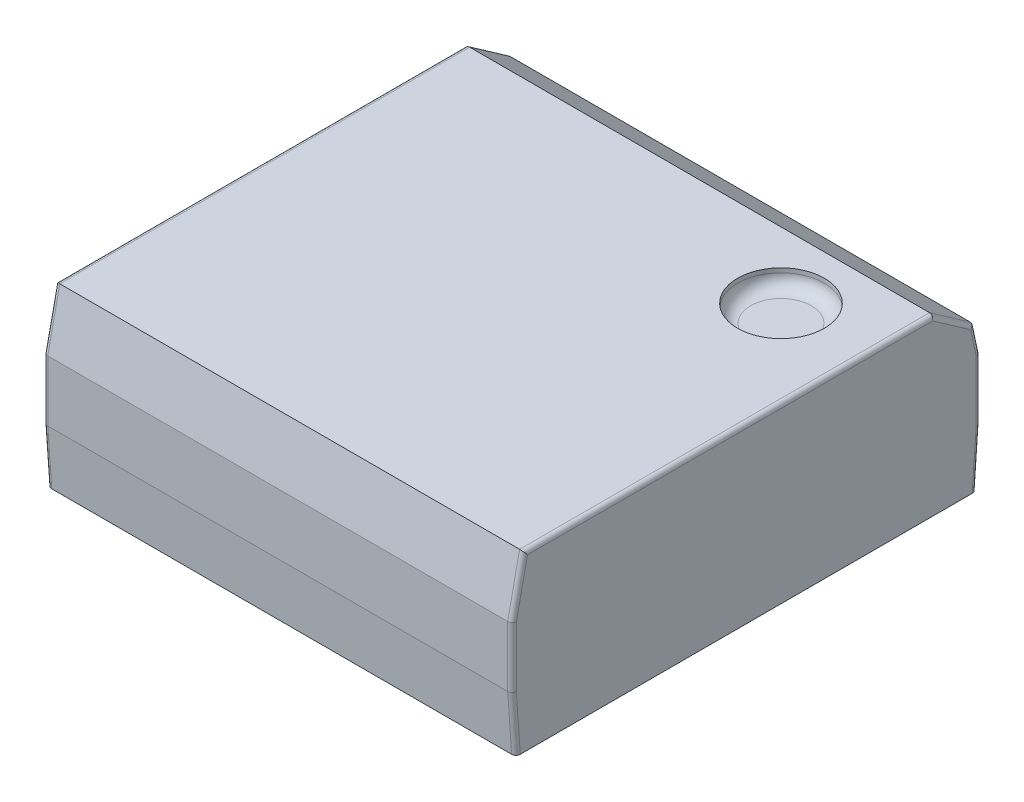
ISO-10303-21;
HEADER;
FILE_DESCRIPTION(('STEP AP214'),'2;1');
FILE_NAME('part.step','',(''),(''),'','','');
FILE_SCHEMA(('AUTOMOTIVE_DESIGN { 1 0 10303 214 1 1 1 1 }'));
ENDSEC;
DATA;
#1=APPLICATION_CONTEXT('core data for automotive mechanical design processes');
#2=APPLICATION_PROTOCOL_DEFINITION('international standard','automotive_design',2000,#1);
#3=PRODUCT_CONTEXT('',#1,'mechanical');
#4=PRODUCT('Part','Part','',(#3));
#5=PRODUCT_RELATED_PRODUCT_CATEGORY('part','',(#4));
#6=PRODUCT_DEFINITION_FORMATION('','',#4);
#7=PRODUCT_DEFINITION_CONTEXT('part definition',#1,'design');
#8=PRODUCT_DEFINITION('design','',#6,#7);
#9=PRODUCT_DEFINITION_SHAPE('','',#8);
#10=(LENGTH_UNIT() NAMED_UNIT(*) SI_UNIT(.MILLI.,.METRE.));
#11=(NAMED_UNIT(*) PLANE_ANGLE_UNIT() SI_UNIT($,.RADIAN.));
#12=(NAMED_UNIT(*) SI_UNIT($,.STERADIAN.) SOLID_ANGLE_UNIT());
#13=UNCERTAINTY_MEASURE_WITH_UNIT(LENGTH_MEASURE(1.E-05),#10,'distance_accuracy_value','');
#14=(GEOMETRIC_REPRESENTATION_CONTEXT(3) GLOBAL_UNCERTAINTY_ASSIGNED_CONTEXT((#13)) GLOBAL_UNIT_ASSIGNED_CONTEXT((#10,
#11,#12)) REPRESENTATION_CONTEXT('',''));
#15=CARTESIAN_POINT('',(0.,0.,0.));
#16=DIRECTION('',(0.,0.,1.));
#17=DIRECTION('',(1.,0.,0.));
#18=AXIS2_PLACEMENT_3D('',#15,#16,#17);
#19=CARTESIAN_POINT('',(1.7,0.8,-1.4));
#20=DIRECTION('',(0.,1.,0.));
#21=DIRECTION('',(0.,0.,1.));
#22=AXIS2_PLACEMENT_3D('',#19,#20,#21);
#23=PLANE('',#22);
#24=CARTESIAN_POINT('',(1.7,0.8,-1.4));
#25=DIRECTION('',(0.,-1.,0.));
#26=DIRECTION('',(0.,0.,-1.));
#27=AXIS2_PLACEMENT_3D('',#24,#25,#26);
#28=CIRCLE('',#27,0.350000000000002);
#29=CARTESIAN_POINT('',(1.7,0.8,-1.05));
#30=VERTEX_POINT('',#29);
#31=CARTESIAN_POINT('',(1.7,0.8,-1.75));
#32=VERTEX_POINT('',#31);
#33=EDGE_CURVE('E283',#30,#32,#28,.F.);
#34=ORIENTED_EDGE('',*,*,#33,.T.);
#35=CARTESIAN_POINT('',(1.7,0.8,-1.4));
#36=DIRECTION('',(0.,-1.,0.));
#37=DIRECTION('',(0.,0.,1.));
#38=AXIS2_PLACEMENT_3D('',#35,#36,#37);
#39=CIRCLE('',#38,0.350000000000002);
#40=EDGE_CURVE('E285',#32,#30,#39,.F.);
#41=ORIENTED_EDGE('',*,*,#40,.T.);
#42=EDGE_LOOP('',(#34,#41));
#43=FACE_BOUND('',#42,.T.);
#44=ADVANCED_FACE('F17',(#43),#23,.T.);
#45=CARTESIAN_POINT('',(1.7,0.95,-1.4));
#46=DIRECTION('',(0.,1.,0.));
#47=DIRECTION('',(0.,0.,1.));
#48=AXIS2_PLACEMENT_3D('',#45,#46,#47);
#49=TOROIDAL_SURFACE('',#48,0.350000000000002,0.15);
#50=CARTESIAN_POINT('',(1.7,0.95,-1.4));
#51=DIRECTION('',(0.,1.,0.));
#52=DIRECTION('',(0.,0.,1.));
#53=AXIS2_PLACEMENT_3D('',#50,#51,#52);
#54=CIRCLE('',#53,0.500000000000002);
#55=CARTESIAN_POINT('',(1.7,0.95,-0.899999999999999));
#56=VERTEX_POINT('',#55);
#57=EDGE_CURVE('E192',#56,#56,#54,.T.);
#58=ORIENTED_EDGE('',*,*,#57,.T.);
#59=EDGE_LOOP('',(#58));
#60=FACE_BOUND('',#59,.T.);
#61=ORIENTED_EDGE('',*,*,#40,.F.);
#62=ORIENTED_EDGE('',*,*,#33,.F.);
#63=EDGE_LOOP('',(#61,#62));
#64=FACE_BOUND('',#63,.T.);
#65=ADVANCED_FACE('F196',(#60,#64),#49,.F.);
#66=CARTESIAN_POINT('',(1.7,0.8,-1.4));
#67=DIRECTION('',(0.,1.,0.));
#68=DIRECTION('',(0.,0.,1.));
#69=AXIS2_PLACEMENT_3D('',#66,#67,#68);
#70=CYLINDRICAL_SURFACE('',#69,0.500000000000002);
#71=CARTESIAN_POINT('',(1.7,1.,-1.4));
#72=DIRECTION('',(0.,1.,0.));
#73=DIRECTION('',(0.,0.,1.));
#74=AXIS2_PLACEMENT_3D('',#71,#72,#73);
#75=CIRCLE('',#74,0.500000000000002);
#76=CARTESIAN_POINT('',(1.7,1.,-0.899999999999999));
#77=VERTEX_POINT('',#76);
#78=EDGE_CURVE('E179',#77,#77,#75,.F.);
#79=ORIENTED_EDGE('',*,*,#78,.F.);
#80=EDGE_LOOP('',(#79));
#81=FACE_BOUND('',#80,.T.);
#82=ORIENTED_EDGE('',*,*,#57,.F.);
#83=EDGE_LOOP('',(#82));
#84=FACE_BOUND('',#83,.T.);
#85=ADVANCED_FACE('F200',(#81,#84),#70,.F.);
#86=CARTESIAN_POINT('',(-2.7,1.,-2.16183823491448));
#87=DIRECTION('',(0.,0.819152044288992,-0.573576436351046));
#88=DIRECTION('',(0.,0.573576436351046,0.819152044288992));
#89=AXIS2_PLACEMENT_3D('',#86,#87,#88);
#90=PLANE('',#89);
#91=DIRECTION('',(1.,0.,0.));
#92=VECTOR('',#91,1.);
#93=CARTESIAN_POINT('',(-2.7,1.,-2.16183823491448));
#94=LINE('',#93,#92);
#95=CARTESIAN_POINT('',(2.65,1.,-2.16183823491449));
#96=VERTEX_POINT('',#95);
#97=CARTESIAN_POINT('',(-2.65,1.,-2.16183823491449));
#98=VERTEX_POINT('',#97);
#99=EDGE_CURVE('E176',#96,#98,#94,.F.);
#100=ORIENTED_EDGE('',*,*,#99,.F.);
#101=DIRECTION('',(0.,0.573576436351046,0.819152044288992));
#102=VECTOR('',#101,1.);
#103=CARTESIAN_POINT('',(2.65,1.,-2.16183823491448));
#104=LINE('',#103,#102);
#105=CARTESIAN_POINT('',(2.65,0.670942073818004,-2.631781656294));
#106=VERTEX_POINT('',#105);
#107=EDGE_CURVE('E187',#96,#106,#104,.F.);
#108=ORIENTED_EDGE('',*,*,#107,.T.);
#109=DIRECTION('',(1.,0.,0.));
#110=VECTOR('',#109,1.);
#111=CARTESIAN_POINT('',(-2.7,0.670942073818004,-2.631781656294));
#112=LINE('',#111,#110);
#113=CARTESIAN_POINT('',(-2.65,0.670942073818004,-2.631781656294));
#114=VERTEX_POINT('',#113);
#115=EDGE_CURVE('E184',#106,#114,#112,.F.);
#116=ORIENTED_EDGE('',*,*,#115,.T.);
#117=DIRECTION('',(0.,0.573576436351046,0.819152044288992));
#118=VECTOR('',#117,1.);
#119=CARTESIAN_POINT('',(-2.65,1.,-2.16183823491448));
#120=LINE('',#119,#118);
#121=EDGE_CURVE('E190',#114,#98,#120,.T.);
#122=ORIENTED_EDGE('',*,*,#121,.T.);
#123=EDGE_LOOP('',(#100,#108,#116,#122));
#124=FACE_BOUND('',#123,.T.);
#125=ADVANCED_FACE('F308',(#124),#90,.T.);
#126=CARTESIAN_POINT('',(-2.7,1.,-2.56183823491449));
#127=DIRECTION('',(0.,-0.207911690817757,0.978147600733806));
#128=DIRECTION('',(0.,-0.978147600733806,-0.207911690817757));
#129=AXIS2_PLACEMENT_3D('',#126,#127,#128);
#130=PLANE('',#129);
#131=DIRECTION('',(0.,-0.978147600733806,-0.207911690817757));
#132=VECTOR('',#131,1.);
#133=CARTESIAN_POINT('',(-2.65,1.,-2.56183823491449));
#134=LINE('',#133,#132);
#135=CARTESIAN_POINT('',(-2.65,0.34999999999999,-2.7));
#136=VERTEX_POINT('',#135);
#137=EDGE_CURVE('E182',#114,#136,#134,.T.);
#138=ORIENTED_EDGE('',*,*,#137,.F.);
#139=ORIENTED_EDGE('',*,*,#115,.F.);
#140=DIRECTION('',(0.,-0.978147600733806,-0.207911690817757));
#141=VECTOR('',#140,1.);
#142=CARTESIAN_POINT('',(2.65,-0.941643183908757,-2.97454723407616));
#143=LINE('',#142,#141);
#144=CARTESIAN_POINT('',(2.65,0.349999999999989,-2.7));
#145=VERTEX_POINT('',#144);
#146=EDGE_CURVE('E149',#145,#106,#143,.F.);
#147=ORIENTED_EDGE('',*,*,#146,.F.);
#148=DIRECTION('',(-1.,0.,0.));
#149=VECTOR('',#148,1.);
#150=CARTESIAN_POINT('',(-2.7,0.349999999999989,-2.7));
#151=LINE('',#150,#149);
#152=EDGE_CURVE('E171',#136,#145,#151,.F.);
#153=ORIENTED_EDGE('',*,*,#152,.F.);
#154=EDGE_LOOP('',(#138,#139,#147,#153));
#155=FACE_BOUND('',#154,.T.);
#156=ADVANCED_FACE('F314',(#155),#130,.F.);
#157=CARTESIAN_POINT('',(-2.7,1.,2.7));
#158=DIRECTION('',(0.,1.,0.));
#159=DIRECTION('',(0.,0.,1.));
#160=AXIS2_PLACEMENT_3D('',#157,#158,#159);
#161=PLANE('',#160);
#162=DIRECTION('',(1.,0.,0.));
#163=VECTOR('',#162,1.);
#164=CARTESIAN_POINT('',(-2.7,1.,2.56183823491449));
#165=LINE('',#164,#163);
#166=CARTESIAN_POINT('',(-2.65,1.,2.56183823491449));
#167=VERTEX_POINT('',#166);
#168=CARTESIAN_POINT('',(2.65,1.,2.56183823491449));
#169=VERTEX_POINT('',#168);
#170=EDGE_CURVE('E165',#167,#169,#165,.T.);
#171=ORIENTED_EDGE('',*,*,#170,.T.);
#172=DIRECTION('',(0.,0.,-1.));
#173=VECTOR('',#172,1.);
#174=CARTESIAN_POINT('',(2.65,1.,2.7));
#175=LINE('',#174,#173);
#176=EDGE_CURVE('E161',#96,#169,#175,.F.);
#177=ORIENTED_EDGE('',*,*,#176,.F.);
#178=ORIENTED_EDGE('',*,*,#99,.T.);
#179=DIRECTION('',(0.,0.,1.));
#180=VECTOR('',#179,1.);
#181=CARTESIAN_POINT('',(-2.65,1.,2.7));
#182=LINE('',#181,#180);
#183=EDGE_CURVE('E265',#167,#98,#182,.F.);
#184=ORIENTED_EDGE('',*,*,#183,.F.);
#185=EDGE_LOOP('',(#171,#177,#178,#184));
#186=FACE_BOUND('',#185,.T.);
#187=ORIENTED_EDGE('',*,*,#78,.T.);
#188=EDGE_LOOP('',(#187));
#189=FACE_BOUND('',#188,.T.);
#190=ADVANCED_FACE('F409',(#186,#189),#161,.T.);
#191=CARTESIAN_POINT('',(-2.7,1.,2.56183823491449));
#192=DIRECTION('',(0.,-0.207911690817757,-0.978147600733806));
#193=DIRECTION('',(0.,0.978147600733806,-0.207911690817757));
#194=AXIS2_PLACEMENT_3D('',#191,#192,#193);
#195=PLANE('',#194);
#196=DIRECTION('',(0.,-0.978147600733806,0.207911690817757));
#197=VECTOR('',#196,1.);
#198=CARTESIAN_POINT('',(-2.65,0.15654575239589,2.74111996971119));
#199=LINE('',#198,#197);
#200=CARTESIAN_POINT('',(-2.65,0.349999999999983,2.7));
#201=VERTEX_POINT('',#200);
#202=EDGE_CURVE('E269',#201,#167,#199,.F.);
#203=ORIENTED_EDGE('',*,*,#202,.F.);
#204=DIRECTION('',(1.,0.,0.));
#205=VECTOR('',#204,1.);
#206=CARTESIAN_POINT('',(-2.7,0.349999999999989,2.7));
#207=LINE('',#206,#205);
#208=CARTESIAN_POINT('',(2.65,0.349999999999989,2.7));
#209=VERTEX_POINT('',#208);
#210=EDGE_CURVE('E166',#209,#201,#207,.F.);
#211=ORIENTED_EDGE('',*,*,#210,.F.);
#212=DIRECTION('',(0.,0.978147600733806,-0.207911690817757));
#213=VECTOR('',#212,1.);
#214=CARTESIAN_POINT('',(2.65,0.15654575239589,2.74111996971119));
#215=LINE('',#214,#213);
#216=EDGE_CURVE('E271',#169,#209,#215,.F.);
#217=ORIENTED_EDGE('',*,*,#216,.F.);
#218=ORIENTED_EDGE('',*,*,#170,.F.);
#219=EDGE_LOOP('',(#203,#211,#217,#218));
#220=FACE_BOUND('',#219,.T.);
#221=ADVANCED_FACE('F405',(#220),#195,.F.);
#222=CARTESIAN_POINT('',(2.65,-1.,2.65));
#223=DIRECTION('',(0.,1.,0.));
#224=DIRECTION('',(0.,0.,1.));
#225=AXIS2_PLACEMENT_3D('',#222,#223,#224);
#226=CYLINDRICAL_SURFACE('',#225,0.0500000000000001);
#227=CARTESIAN_POINT('',(2.65,0.344744788236705,2.65));
#228=DIRECTION('',(0.,0.994521895368274,-0.104528463267652));
#229=DIRECTION('',(0.,-0.104528463267651,-0.994521895368274));
#230=AXIS2_PLACEMENT_3D('',#227,#228,#229);
#231=ELLIPSE('',#230,0.0502754139781759,0.0500000000000001);
#232=CARTESIAN_POINT('',(2.7,0.344744788236706,2.65));
#233=VERTEX_POINT('',#232);
#234=EDGE_CURVE('E275',#209,#233,#231,.T.);
#235=ORIENTED_EDGE('',*,*,#234,.F.);
#236=DIRECTION('',(0.,1.,0.));
#237=VECTOR('',#236,1.);
#238=CARTESIAN_POINT('',(2.65,-1.,2.7));
#239=LINE('',#238,#237);
#240=CARTESIAN_POINT('',(2.65,-0.349999999999987,2.7));
#241=VERTEX_POINT('',#240);
#242=EDGE_CURVE('E250',#241,#209,#239,.T.);
#243=ORIENTED_EDGE('',*,*,#242,.F.);
#244=CARTESIAN_POINT('',(2.65,-0.348253961525384,2.65));
#245=DIRECTION('',(0.,-0.999390827019096,-0.0348994967024994));
#246=DIRECTION('',(0.,0.0348994967024985,-0.999390827019096));
#247=AXIS2_PLACEMENT_3D('',#244,#245,#246);
#248=ELLIPSE('',#247,0.0500304772149412,0.0500000000000001);
#249=CARTESIAN_POINT('',(2.7,-0.348253961525383,2.65));
#250=VERTEX_POINT('',#249);
#251=EDGE_CURVE('E247',#250,#241,#248,.T.);
#252=ORIENTED_EDGE('',*,*,#251,.F.);
#253=DIRECTION('',(0.,1.,0.));
#254=VECTOR('',#253,1.);
#255=CARTESIAN_POINT('',(2.7,-1.,2.65));
#256=LINE('',#255,#254);
#257=EDGE_CURVE('E249',#233,#250,#256,.F.);
#258=ORIENTED_EDGE('',*,*,#257,.F.);
#259=EDGE_LOOP('',(#235,#243,#252,#258));
#260=FACE_BOUND('',#259,.T.);
#261=ADVANCED_FACE('F402',(#260),#226,.T.);
#262=CARTESIAN_POINT('',(2.65,-0.952038768449645,-2.92563985403947));
#263=DIRECTION('',(0.,-0.978147600733806,-0.207911690817757));
#264=DIRECTION('',(0.,0.207911690817757,-0.978147600733806));
#265=AXIS2_PLACEMENT_3D('',#262,#263,#264);
#266=CYLINDRICAL_SURFACE('',#265,0.0500000000000001);
#267=CARTESIAN_POINT('',(2.65,0.641281359945783,-2.5869692059081));
#268=DIRECTION('',(0.,0.833885822067169,0.551936985312058));
#269=DIRECTION('',(0.,-0.551936985312058,0.833885822067169));
#270=AXIS2_PLACEMENT_3D('',#267,#268,#269);
#271=ELLIPSE('',#270,0.0537393120257227,0.0500000000000001);
#272=CARTESIAN_POINT('',(2.7,0.641281359945782,-2.5869692059081));
#273=VERTEX_POINT('',#272);
#274=EDGE_CURVE('E147',#273,#106,#271,.T.);
#275=ORIENTED_EDGE('',*,*,#274,.F.);
#276=DIRECTION('',(0.,0.978147600733806,0.207911690817757));
#277=VECTOR('',#276,1.);
#278=CARTESIAN_POINT('',(2.7,0.344744788236705,-2.65));
#279=LINE('',#278,#277);
#280=CARTESIAN_POINT('',(2.7,0.344744788236704,-2.65));
#281=VERTEX_POINT('',#280);
#282=EDGE_CURVE('E133',#281,#273,#279,.T.);
#283=ORIENTED_EDGE('',*,*,#282,.F.);
#284=CARTESIAN_POINT('',(2.65,0.344744788236705,-2.65));
#285=DIRECTION('',(0.,0.994521895368273,0.104528463267652));
#286=DIRECTION('',(0.,0.104528463267652,-0.994521895368274));
#287=AXIS2_PLACEMENT_3D('',#284,#285,#286);
#288=ELLIPSE('',#287,0.0502754139781759,0.0500000000000001);
#289=EDGE_CURVE('E175',#145,#281,#288,.F.);
#290=ORIENTED_EDGE('',*,*,#289,.F.);
#291=ORIENTED_EDGE('',*,*,#146,.T.);
#292=EDGE_LOOP('',(#275,#283,#290,#291));
#293=FACE_BOUND('',#292,.T.);
#294=ADVANCED_FACE('F148',(#293),#266,.T.);
#295=CARTESIAN_POINT('',(2.65,0.0482092213912311,-3.43396399843907));
#296=DIRECTION('',(0.,0.573576436351046,0.819152044288992));
#297=DIRECTION('',(0.,-0.819152044288992,0.573576436351046));
#298=AXIS2_PLACEMENT_3D('',#295,#296,#297);
#299=CYLINDRICAL_SURFACE('',#298,0.05);
#300=CARTESIAN_POINT('',(2.65,0.95,-2.14607329547054));
#301=DIRECTION('',(0.,-0.300705799504273,-0.953716950748227));
#302=DIRECTION('',(0.,0.953716950748227,-0.300705799504273));
#303=AXIS2_PLACEMENT_3D('',#300,#301,#302);
#304=ELLIPSE('',#303,0.0524264562570406,0.0500000000000001);
#305=CARTESIAN_POINT('',(2.7,0.95,-2.14607329547054));
#306=VERTEX_POINT('',#305);
#307=EDGE_CURVE('E151',#306,#96,#304,.F.);
#308=ORIENTED_EDGE('',*,*,#307,.F.);
#309=DIRECTION('',(0.,0.573576436351046,0.819152044288992));
#310=VECTOR('',#309,1.);
#311=CARTESIAN_POINT('',(2.7,0.641281359945782,-2.5869692059081));
#312=LINE('',#311,#310);
#313=EDGE_CURVE('E137',#273,#306,#312,.T.);
#314=ORIENTED_EDGE('',*,*,#313,.F.);
#315=ORIENTED_EDGE('',*,*,#274,.T.);
#316=ORIENTED_EDGE('',*,*,#107,.F.);
#317=EDGE_LOOP('',(#308,#314,#315,#316));
#318=FACE_BOUND('',#317,.T.);
#319=ADVANCED_FACE('F153',(#318),#299,.T.);
#320=CARTESIAN_POINT('',(2.65,0.95,2.7));
#321=DIRECTION('',(0.,0.,-1.));
#322=DIRECTION('',(-1.,0.,0.));
#323=AXIS2_PLACEMENT_3D('',#320,#321,#322);
#324=CYLINDRICAL_SURFACE('',#323,0.0500000000000001);
#325=ORIENTED_EDGE('',*,*,#307,.T.);
#326=ORIENTED_EDGE('',*,*,#176,.T.);
#327=CARTESIAN_POINT('',(2.65,0.95,2.52134903325473));
#328=DIRECTION('',(0.,0.629320391049839,-0.77714596145697));
#329=DIRECTION('',(0.,0.77714596145697,0.629320391049838));
#330=AXIS2_PLACEMENT_3D('',#327,#328,#329);
#331=ELLIPSE('',#330,0.0643379782946586,0.0500000000000001);
#332=CARTESIAN_POINT('',(2.7,0.95,2.52134903325473));
#333=VERTEX_POINT('',#332);
#334=EDGE_CURVE('E272',#333,#169,#331,.F.);
#335=ORIENTED_EDGE('',*,*,#334,.F.);
#336=DIRECTION('',(0.,0.,-1.));
#337=VECTOR('',#336,1.);
#338=CARTESIAN_POINT('',(2.7,0.95,-2.7));
#339=LINE('',#338,#337);
#340=EDGE_CURVE('E156',#306,#333,#339,.F.);
#341=ORIENTED_EDGE('',*,*,#340,.F.);
#342=EDGE_LOOP('',(#325,#326,#335,#341));
#343=FACE_BOUND('',#342,.T.);
#344=ADVANCED_FACE('F393',(#343),#324,.T.);
#345=CARTESIAN_POINT('',(2.65,0.146150167855002,2.6922125896745));
#346=DIRECTION('',(0.,0.978147600733806,-0.207911690817757));
#347=DIRECTION('',(0.,0.207911690817757,0.978147600733806));
#348=AXIS2_PLACEMENT_3D('',#345,#346,#347);
#349=CYLINDRICAL_SURFACE('',#348,0.0500000000000001);
#350=ORIENTED_EDGE('',*,*,#334,.T.);
#351=ORIENTED_EDGE('',*,*,#216,.T.);
#352=ORIENTED_EDGE('',*,*,#234,.T.);
#353=DIRECTION('',(0.,-0.978147600733806,0.207911690817757));
#354=VECTOR('',#353,1.);
#355=CARTESIAN_POINT('',(2.7,0.95,2.52134903325473));
#356=LINE('',#355,#354);
#357=EDGE_CURVE('E158',#333,#233,#356,.T.);
#358=ORIENTED_EDGE('',*,*,#357,.F.);
#359=EDGE_LOOP('',(#350,#351,#352,#358));
#360=FACE_BOUND('',#359,.T.);
#361=ADVANCED_FACE('F389',(#360),#349,.T.);
#362=CARTESIAN_POINT('',(2.65,-1.,-2.65));
#363=DIRECTION('',(0.,1.,0.));
#364=DIRECTION('',(0.,0.,1.));
#365=AXIS2_PLACEMENT_3D('',#362,#363,#364);
#366=CYLINDRICAL_SURFACE('',#365,0.0500000000000001);
#367=ORIENTED_EDGE('',*,*,#289,.T.);
#368=DIRECTION('',(0.,1.,0.));
#369=VECTOR('',#368,1.);
#370=CARTESIAN_POINT('',(2.7,-1.,-2.65));
#371=LINE('',#370,#369);
#372=CARTESIAN_POINT('',(2.7,-0.348253961525384,-2.65));
#373=VERTEX_POINT('',#372);
#374=EDGE_CURVE('E141',#373,#281,#371,.T.);
#375=ORIENTED_EDGE('',*,*,#374,.F.);
#376=CARTESIAN_POINT('',(2.65,-0.348253961525388,-2.65));
#377=DIRECTION('',(0.,0.999390827019096,-0.0348994967024994));
#378=DIRECTION('',(0.,-0.0348994967024985,-0.999390827019096));
#379=AXIS2_PLACEMENT_3D('',#376,#377,#378);
#380=ELLIPSE('',#379,0.0500304772149412,0.0500000000000001);
#381=CARTESIAN_POINT('',(2.65,-0.349999999999987,-2.7));
#382=VERTEX_POINT('',#381);
#383=EDGE_CURVE('E244',#382,#373,#380,.F.);
#384=ORIENTED_EDGE('',*,*,#383,.F.);
#385=DIRECTION('',(0.,1.,0.));
#386=VECTOR('',#385,1.);
#387=CARTESIAN_POINT('',(2.65,-1.,-2.7));
#388=LINE('',#387,#386);
#389=EDGE_CURVE('E174',#145,#382,#388,.F.);
#390=ORIENTED_EDGE('',*,*,#389,.F.);
#391=EDGE_LOOP('',(#367,#375,#384,#390));
#392=FACE_BOUND('',#391,.T.);
#393=ADVANCED_FACE('F385',(#392),#366,.T.);
#394=CARTESIAN_POINT('',(-2.7,-1.,-2.7));
#395=DIRECTION('',(0.,0.,-1.));
#396=DIRECTION('',(-1.,0.,0.));
#397=AXIS2_PLACEMENT_3D('',#394,#395,#396);
#398=PLANE('',#397);
#399=ORIENTED_EDGE('',*,*,#152,.T.);
#400=ORIENTED_EDGE('',*,*,#389,.T.);
#401=DIRECTION('',(1.,0.,0.));
#402=VECTOR('',#401,1.);
#403=CARTESIAN_POINT('',(-2.7,-0.349999999999969,-2.7));
#404=LINE('',#403,#402);
#405=CARTESIAN_POINT('',(-2.65,-0.349999999999987,-2.7));
#406=VERTEX_POINT('',#405);
#407=EDGE_CURVE('E445',#406,#382,#404,.T.);
#408=ORIENTED_EDGE('',*,*,#407,.F.);
#409=DIRECTION('',(0.,1.,0.));
#410=VECTOR('',#409,1.);
#411=CARTESIAN_POINT('',(-2.65,-1.,-2.7));
#412=LINE('',#411,#410);
#413=EDGE_CURVE('E255',#136,#406,#412,.F.);
#414=ORIENTED_EDGE('',*,*,#413,.F.);
#415=EDGE_LOOP('',(#399,#400,#408,#414));
#416=FACE_BOUND('',#415,.T.);
#417=ADVANCED_FACE('F381',(#416),#398,.T.);
#418=CARTESIAN_POINT('',(-2.65,0.146150167855002,2.6922125896745));
#419=DIRECTION('',(0.,-0.978147600733806,0.207911690817757));
#420=DIRECTION('',(0.,-0.207911690817757,-0.978147600733806));
#421=AXIS2_PLACEMENT_3D('',#418,#419,#420);
#422=CYLINDRICAL_SURFACE('',#421,0.0500000000000001);
#423=CARTESIAN_POINT('',(-2.65,0.95,2.52134903325473));
#424=DIRECTION('',(0.,-0.629320391049839,0.77714596145697));
#425=DIRECTION('',(0.,0.77714596145697,0.629320391049838));
#426=AXIS2_PLACEMENT_3D('',#423,#424,#425);
#427=ELLIPSE('',#426,0.0643379782946586,0.0500000000000001);
#428=CARTESIAN_POINT('',(-2.7,0.95,2.52134903325473));
#429=VERTEX_POINT('',#428);
#430=EDGE_CURVE('E266',#429,#167,#427,.F.);
#431=ORIENTED_EDGE('',*,*,#430,.F.);
#432=DIRECTION('',(0.,0.978147600733806,-0.207911690817757));
#433=VECTOR('',#432,1.);
#434=CARTESIAN_POINT('',(-2.7,0.344744788236704,2.65));
#435=LINE('',#434,#433);
#436=CARTESIAN_POINT('',(-2.7,0.344744788236698,2.65));
#437=VERTEX_POINT('',#436);
#438=EDGE_CURVE('E450',#437,#429,#435,.T.);
#439=ORIENTED_EDGE('',*,*,#438,.F.);
#440=CARTESIAN_POINT('',(-2.65,0.344744788236694,2.65));
#441=DIRECTION('',(0.,0.994521895368274,-0.104528463267652));
#442=DIRECTION('',(0.,0.104528463267651,0.994521895368274));
#443=AXIS2_PLACEMENT_3D('',#440,#441,#442);
#444=ELLIPSE('',#443,0.0502754139781759,0.0500000000000001);
#445=EDGE_CURVE('E170',#201,#437,#444,.F.);
#446=ORIENTED_EDGE('',*,*,#445,.F.);
#447=ORIENTED_EDGE('',*,*,#202,.T.);
#448=EDGE_LOOP('',(#431,#439,#446,#447));
#449=FACE_BOUND('',#448,.T.);
#450=ADVANCED_FACE('F377',(#449),#422,.T.);
#451=CARTESIAN_POINT('',(-2.65,0.95,2.7));
#452=DIRECTION('',(0.,0.,1.));
#453=DIRECTION('',(1.,0.,0.));
#454=AXIS2_PLACEMENT_3D('',#451,#452,#453);
#455=CYLINDRICAL_SURFACE('',#454,0.0500000000000001);
#456=ORIENTED_EDGE('',*,*,#430,.T.);
#457=ORIENTED_EDGE('',*,*,#183,.T.);
#458=CARTESIAN_POINT('',(-2.65,0.95,-2.14607329547054));
#459=DIRECTION('',(0.,-0.300705799504273,-0.953716950748227));
#460=DIRECTION('',(0.,-0.953716950748227,0.300705799504273));
#461=AXIS2_PLACEMENT_3D('',#458,#459,#460);
#462=ELLIPSE('',#461,0.0524264562570406,0.0500000000000001);
#463=CARTESIAN_POINT('',(-2.7,0.95,-2.14607329547054));
#464=VERTEX_POINT('',#463);
#465=EDGE_CURVE('E262',#464,#98,#462,.T.);
#466=ORIENTED_EDGE('',*,*,#465,.F.);
#467=DIRECTION('',(0.,0.,1.));
#468=VECTOR('',#467,1.);
#469=CARTESIAN_POINT('',(-2.7,0.95,-2.7));
#470=LINE('',#469,#468);
#471=EDGE_CURVE('E452',#429,#464,#470,.F.);
#472=ORIENTED_EDGE('',*,*,#471,.F.);
#473=EDGE_LOOP('',(#456,#457,#466,#472));
#474=FACE_BOUND('',#473,.T.);
#475=ADVANCED_FACE('F373',(#474),#455,.T.);
#476=CARTESIAN_POINT('',(-2.65,0.0482092213912311,-3.43396399843907));
#477=DIRECTION('',(0.,-0.573576436351046,-0.819152044288992));
#478=DIRECTION('',(0.,0.819152044288992,-0.573576436351046));
#479=AXIS2_PLACEMENT_3D('',#476,#477,#478);
#480=CYLINDRICAL_SURFACE('',#479,0.05);
#481=ORIENTED_EDGE('',*,*,#465,.T.);
#482=ORIENTED_EDGE('',*,*,#121,.F.);
#483=CARTESIAN_POINT('',(-2.65,0.641281359945782,-2.5869692059081));
#484=DIRECTION('',(0.,0.833885822067169,0.551936985312058));
#485=DIRECTION('',(0.,0.551936985312058,-0.833885822067169));
#486=AXIS2_PLACEMENT_3D('',#483,#484,#485);
#487=ELLIPSE('',#486,0.0537393120257227,0.0500000000000001);
#488=CARTESIAN_POINT('',(-2.7,0.641281359945782,-2.5869692059081));
#489=VERTEX_POINT('',#488);
#490=EDGE_CURVE('E259',#489,#114,#487,.F.);
#491=ORIENTED_EDGE('',*,*,#490,.F.);
#492=DIRECTION('',(0.,-0.573576436351046,-0.819152044288992));
#493=VECTOR('',#492,1.);
#494=CARTESIAN_POINT('',(-2.7,0.95,-2.14607329547054));
#495=LINE('',#494,#493);
#496=EDGE_CURVE('E456',#464,#489,#495,.T.);
#497=ORIENTED_EDGE('',*,*,#496,.F.);
#498=EDGE_LOOP('',(#481,#482,#491,#497));
#499=FACE_BOUND('',#498,.T.);
#500=ADVANCED_FACE('F369',(#499),#480,.T.);
#501=CARTESIAN_POINT('',(-2.65,-0.952038768449645,-2.92563985403947));
#502=DIRECTION('',(0.,0.978147600733806,0.207911690817757));
#503=DIRECTION('',(0.,-0.207911690817757,0.978147600733806));
#504=AXIS2_PLACEMENT_3D('',#501,#502,#503);
#505=CYLINDRICAL_SURFACE('',#504,0.0500000000000001);
#506=ORIENTED_EDGE('',*,*,#490,.T.);
#507=ORIENTED_EDGE('',*,*,#137,.T.);
#508=CARTESIAN_POINT('',(-2.65,0.344744788236705,-2.65));
#509=DIRECTION('',(0.,0.994521895368273,0.104528463267652));
#510=DIRECTION('',(0.,0.104528463267652,-0.994521895368274));
#511=AXIS2_PLACEMENT_3D('',#508,#509,#510);
#512=ELLIPSE('',#511,0.0502754139781759,0.0500000000000001);
#513=CARTESIAN_POINT('',(-2.7,0.344744788236704,-2.65));
#514=VERTEX_POINT('',#513);
#515=EDGE_CURVE('E256',#514,#136,#512,.F.);
#516=ORIENTED_EDGE('',*,*,#515,.F.);
#517=DIRECTION('',(0.,-0.978147600733806,-0.207911690817757));
#518=VECTOR('',#517,1.);
#519=CARTESIAN_POINT('',(-2.7,0.641281359945782,-2.5869692059081));
#520=LINE('',#519,#518);
#521=EDGE_CURVE('E425',#489,#514,#520,.T.);
#522=ORIENTED_EDGE('',*,*,#521,.F.);
#523=EDGE_LOOP('',(#506,#507,#516,#522));
#524=FACE_BOUND('',#523,.T.);
#525=ADVANCED_FACE('F365',(#524),#505,.T.);
#526=CARTESIAN_POINT('',(-2.65,-1.,-2.65));
#527=DIRECTION('',(0.,1.,0.));
#528=DIRECTION('',(0.,0.,1.));
#529=AXIS2_PLACEMENT_3D('',#526,#527,#528);
#530=CYLINDRICAL_SURFACE('',#529,0.0500000000000001);
#531=ORIENTED_EDGE('',*,*,#515,.T.);
#532=ORIENTED_EDGE('',*,*,#413,.T.);
#533=CARTESIAN_POINT('',(-2.65,-0.348253961525388,-2.65));
#534=DIRECTION('',(0.,-0.999390827019096,0.0348994967024994));
#535=DIRECTION('',(0.,0.0348994967024985,0.999390827019096));
#536=AXIS2_PLACEMENT_3D('',#533,#534,#535);
#537=ELLIPSE('',#536,0.0500304772149412,0.0500000000000001);
#538=CARTESIAN_POINT('',(-2.7,-0.348253961525393,-2.65));
#539=VERTEX_POINT('',#538);
#540=EDGE_CURVE('E240',#539,#406,#537,.T.);
#541=ORIENTED_EDGE('',*,*,#540,.F.);
#542=DIRECTION('',(0.,1.,0.));
#543=VECTOR('',#542,1.);
#544=CARTESIAN_POINT('',(-2.7,-1.,-2.65));
#545=LINE('',#544,#543);
#546=EDGE_CURVE('E459',#514,#539,#545,.F.);
#547=ORIENTED_EDGE('',*,*,#546,.F.);
#548=EDGE_LOOP('',(#531,#532,#541,#547));
#549=FACE_BOUND('',#548,.T.);
#550=ADVANCED_FACE('F361',(#549),#530,.T.);
#551=CARTESIAN_POINT('',(-2.65,-1.,2.65));
#552=DIRECTION('',(0.,1.,0.));
#553=DIRECTION('',(0.,0.,1.));
#554=AXIS2_PLACEMENT_3D('',#551,#552,#553);
#555=CYLINDRICAL_SURFACE('',#554,0.0500000000000001);
#556=ORIENTED_EDGE('',*,*,#445,.T.);
#557=DIRECTION('',(0.,1.,0.));
#558=VECTOR('',#557,1.);
#559=CARTESIAN_POINT('',(-2.7,-1.,2.65));
#560=LINE('',#559,#558);
#561=CARTESIAN_POINT('',(-2.7,-0.348253961525369,2.65));
#562=VERTEX_POINT('',#561);
#563=EDGE_CURVE('E239',#562,#437,#560,.T.);
#564=ORIENTED_EDGE('',*,*,#563,.F.);
#565=CARTESIAN_POINT('',(-2.65,-0.348253961525373,2.65));
#566=DIRECTION('',(0.,0.999390827019096,0.0348994967024994));
#567=DIRECTION('',(0.,-0.0348994967024985,0.999390827019096));
#568=AXIS2_PLACEMENT_3D('',#565,#566,#567);
#569=ELLIPSE('',#568,0.0500304772149412,0.0500000000000001);
#570=CARTESIAN_POINT('',(-2.65,-0.349999999999983,2.7));
#571=VERTEX_POINT('',#570);
#572=EDGE_CURVE('E233',#571,#562,#569,.F.);
#573=ORIENTED_EDGE('',*,*,#572,.F.);
#574=DIRECTION('',(0.,1.,0.));
#575=VECTOR('',#574,1.);
#576=CARTESIAN_POINT('',(-2.65,-1.,2.7));
#577=LINE('',#576,#575);
#578=EDGE_CURVE('E169',#201,#571,#577,.F.);
#579=ORIENTED_EDGE('',*,*,#578,.F.);
#580=EDGE_LOOP('',(#556,#564,#573,#579));
#581=FACE_BOUND('',#580,.T.);
#582=ADVANCED_FACE('F357',(#581),#555,.T.);
#583=CARTESIAN_POINT('',(-2.7,-1.,2.7));
#584=DIRECTION('',(0.,0.,1.));
#585=DIRECTION('',(1.,0.,0.));
#586=AXIS2_PLACEMENT_3D('',#583,#584,#585);
#587=PLANE('',#586);
#588=DIRECTION('',(1.,0.,0.));
#589=VECTOR('',#588,1.);
#590=CARTESIAN_POINT('',(-2.7,-0.349999999999969,2.7));
#591=LINE('',#590,#589);
#592=EDGE_CURVE('E232',#241,#571,#591,.F.);
#593=ORIENTED_EDGE('',*,*,#592,.F.);
#594=ORIENTED_EDGE('',*,*,#242,.T.);
#595=ORIENTED_EDGE('',*,*,#210,.T.);
#596=ORIENTED_EDGE('',*,*,#578,.T.);
#597=EDGE_LOOP('',(#593,#594,#595,#596));
#598=FACE_BOUND('',#597,.T.);
#599=ADVANCED_FACE('F353',(#598),#587,.T.);
#600=CARTESIAN_POINT('',(2.65,-1.36911667124597,2.57861432527723));
#601=DIRECTION('',(0.,-0.997564050259825,-0.0697564737441222));
#602=DIRECTION('',(0.,0.0697564737441222,-0.997564050259825));
#603=AXIS2_PLACEMENT_3D('',#600,#601,#602);
#604=CYLINDRICAL_SURFACE('',#603,0.0500000000000001);
#605=ORIENTED_EDGE('',*,*,#251,.T.);
#606=DIRECTION('',(0.,-0.997564050259825,-0.0697564737441222));
#607=VECTOR('',#606,1.);
#608=CARTESIAN_POINT('',(2.65,-0.349999999999969,2.7));
#609=LINE('',#608,#607);
#610=CARTESIAN_POINT('',(2.65,-1.,2.65454757223672));
#611=VERTEX_POINT('',#610);
#612=EDGE_CURVE('E230',#611,#241,#609,.F.);
#613=ORIENTED_EDGE('',*,*,#612,.F.);
#614=CARTESIAN_POINT('',(2.65,-1.,2.60442547733266));
#615=DIRECTION('',(0.,1.,0.));
#616=DIRECTION('',(0.,0.,-1.));
#617=AXIS2_PLACEMENT_3D('',#614,#615,#616);
#618=ELLIPSE('',#617,0.0501220949040587,0.0500000000000001);
#619=CARTESIAN_POINT('',(2.7,-1.,2.60442547733266));
#620=VERTEX_POINT('',#619);
#621=EDGE_CURVE('E227',#611,#620,#618,.T.);
#622=ORIENTED_EDGE('',*,*,#621,.T.);
#623=DIRECTION('',(0.,-0.997564050259824,-0.0697564737441261));
#624=VECTOR('',#623,1.);
#625=CARTESIAN_POINT('',(2.7,-0.348253961525382,2.65));
#626=LINE('',#625,#624);
#627=EDGE_CURVE('E439',#250,#620,#626,.T.);
#628=ORIENTED_EDGE('',*,*,#627,.F.);
#629=EDGE_LOOP('',(#605,#613,#622,#628));
#630=FACE_BOUND('',#629,.T.);
#631=ADVANCED_FACE('F350',(#630),#604,.T.);
#632=CARTESIAN_POINT('',(2.7,-1.,-2.7));
#633=DIRECTION('',(1.,0.,0.));
#634=DIRECTION('',(0.,0.,-1.));
#635=AXIS2_PLACEMENT_3D('',#632,#633,#634);
#636=PLANE('',#635);
#637=ORIENTED_EDGE('',*,*,#340,.T.);
#638=ORIENTED_EDGE('',*,*,#357,.T.);
#639=ORIENTED_EDGE('',*,*,#257,.T.);
#640=ORIENTED_EDGE('',*,*,#627,.T.);
#641=DIRECTION('',(0.,0.,1.));
#642=VECTOR('',#641,1.);
#643=CARTESIAN_POINT('',(2.7,-1.,2.7));
#644=LINE('',#643,#642);
#645=CARTESIAN_POINT('',(2.7,-1.,-2.60442547733266));
#646=VERTEX_POINT('',#645);
#647=EDGE_CURVE('E226',#620,#646,#644,.F.);
#648=ORIENTED_EDGE('',*,*,#647,.T.);
#649=DIRECTION('',(0.,0.997564050259825,-0.0697564737441222));
#650=VECTOR('',#649,1.);
#651=CARTESIAN_POINT('',(2.7,-0.993349298653804,-2.60489053967499));
#652=LINE('',#651,#650);
#653=EDGE_CURVE('E246',#373,#646,#652,.F.);
#654=ORIENTED_EDGE('',*,*,#653,.F.);
#655=ORIENTED_EDGE('',*,*,#374,.T.);
#656=ORIENTED_EDGE('',*,*,#282,.T.);
#657=ORIENTED_EDGE('',*,*,#313,.T.);
#658=EDGE_LOOP('',(#637,#638,#639,#640,#648,#654,#655,#656,#657));
#659=FACE_BOUND('',#658,.T.);
#660=ADVANCED_FACE('F135',(#659),#636,.T.);
#661=CARTESIAN_POINT('',(2.65,-0.993349298653804,-2.60489053967499));
#662=DIRECTION('',(0.,0.997564050259825,-0.0697564737441222));
#663=DIRECTION('',(0.,0.0697564737441222,0.997564050259825));
#664=AXIS2_PLACEMENT_3D('',#661,#662,#663);
#665=CYLINDRICAL_SURFACE('',#664,0.0500000000000001);
#666=ORIENTED_EDGE('',*,*,#383,.T.);
#667=ORIENTED_EDGE('',*,*,#653,.T.);
#668=CARTESIAN_POINT('',(2.65,-1.,-2.60442547733266));
#669=DIRECTION('',(0.,1.,0.));
#670=DIRECTION('',(0.,0.,-1.));
#671=AXIS2_PLACEMENT_3D('',#668,#669,#670);
#672=ELLIPSE('',#671,0.0501220949040587,0.0500000000000001);
#673=CARTESIAN_POINT('',(2.65,-1.,-2.65454757223672));
#674=VERTEX_POINT('',#673);
#675=EDGE_CURVE('E223',#646,#674,#672,.T.);
#676=ORIENTED_EDGE('',*,*,#675,.T.);
#677=DIRECTION('',(0.,0.997564050259825,-0.0697564737441222));
#678=VECTOR('',#677,1.);
#679=CARTESIAN_POINT('',(2.65,-0.349999999999969,-2.7));
#680=LINE('',#679,#678);
#681=EDGE_CURVE('E243',#382,#674,#680,.F.);
#682=ORIENTED_EDGE('',*,*,#681,.F.);
#683=EDGE_LOOP('',(#666,#667,#676,#682));
#684=FACE_BOUND('',#683,.T.);
#685=ADVANCED_FACE('F343',(#684),#665,.T.);
#686=CARTESIAN_POINT('',(-2.7,-0.349999999999969,-2.7));
#687=DIRECTION('',(0.,-0.0697564737441222,-0.997564050259825));
#688=DIRECTION('',(0.,0.997564050259825,-0.0697564737441222));
#689=AXIS2_PLACEMENT_3D('',#686,#687,#688);
#690=PLANE('',#689);
#691=ORIENTED_EDGE('',*,*,#407,.T.);
#692=ORIENTED_EDGE('',*,*,#681,.T.);
#693=DIRECTION('',(1.,0.,0.));
#694=VECTOR('',#693,1.);
#695=CARTESIAN_POINT('',(-2.7,-1.,-2.65454757223672));
#696=LINE('',#695,#694);
#697=CARTESIAN_POINT('',(-2.65,-1.,-2.65454757223672));
#698=VERTEX_POINT('',#697);
#699=EDGE_CURVE('E222',#674,#698,#696,.F.);
#700=ORIENTED_EDGE('',*,*,#699,.T.);
#701=DIRECTION('',(0.,0.997564050259825,-0.0697564737441222));
#702=VECTOR('',#701,1.);
#703=CARTESIAN_POINT('',(-2.65,-0.349999999999969,-2.7));
#704=LINE('',#703,#702);
#705=EDGE_CURVE('E237',#406,#698,#704,.F.);
#706=ORIENTED_EDGE('',*,*,#705,.F.);
#707=EDGE_LOOP('',(#691,#692,#700,#706));
#708=FACE_BOUND('',#707,.T.);
#709=ADVANCED_FACE('F339',(#708),#690,.T.);
#710=CARTESIAN_POINT('',(-2.65,-0.993349298653804,-2.60489053967499));
#711=DIRECTION('',(0.,-0.997564050259825,0.0697564737441222));
#712=DIRECTION('',(0.,-0.0697564737441222,-0.997564050259825));
#713=AXIS2_PLACEMENT_3D('',#710,#711,#712);
#714=CYLINDRICAL_SURFACE('',#713,0.0500000000000001);
#715=ORIENTED_EDGE('',*,*,#540,.T.);
#716=ORIENTED_EDGE('',*,*,#705,.T.);
#717=CARTESIAN_POINT('',(-2.65,-1.,-2.60442547733266));
#718=DIRECTION('',(0.,1.,0.));
#719=DIRECTION('',(0.,0.,1.));
#720=AXIS2_PLACEMENT_3D('',#717,#718,#719);
#721=ELLIPSE('',#720,0.0501220949040587,0.0500000000000001);
#722=CARTESIAN_POINT('',(-2.7,-1.,-2.60442547733266));
#723=VERTEX_POINT('',#722);
#724=EDGE_CURVE('E219',#698,#723,#721,.T.);
#725=ORIENTED_EDGE('',*,*,#724,.T.);
#726=DIRECTION('',(0.,-0.997564050259825,0.0697564737441222));
#727=VECTOR('',#726,1.);
#728=CARTESIAN_POINT('',(-2.7,-0.348253961525382,-2.65));
#729=LINE('',#728,#727);
#730=EDGE_CURVE('E236',#539,#723,#729,.T.);
#731=ORIENTED_EDGE('',*,*,#730,.F.);
#732=EDGE_LOOP('',(#715,#716,#725,#731));
#733=FACE_BOUND('',#732,.T.);
#734=ADVANCED_FACE('F335',(#733),#714,.T.);
#735=CARTESIAN_POINT('',(-2.7,-1.,-2.7));
#736=DIRECTION('',(-1.,0.,0.));
#737=DIRECTION('',(0.,0.,1.));
#738=AXIS2_PLACEMENT_3D('',#735,#736,#737);
#739=PLANE('',#738);
#740=ORIENTED_EDGE('',*,*,#546,.T.);
#741=ORIENTED_EDGE('',*,*,#730,.T.);
#742=DIRECTION('',(0.,0.,1.));
#743=VECTOR('',#742,1.);
#744=CARTESIAN_POINT('',(-2.7,-1.,2.7));
#745=LINE('',#744,#743);
#746=CARTESIAN_POINT('',(-2.7,-1.,2.60442547733266));
#747=VERTEX_POINT('',#746);
#748=EDGE_CURVE('E218',#723,#747,#745,.T.);
#749=ORIENTED_EDGE('',*,*,#748,.T.);
#750=DIRECTION('',(0.,0.997564050259825,0.0697564737441222));
#751=VECTOR('',#750,1.);
#752=CARTESIAN_POINT('',(-2.7,-1.36911667124597,2.57861432527723));
#753=LINE('',#752,#751);
#754=EDGE_CURVE('E235',#562,#747,#753,.F.);
#755=ORIENTED_EDGE('',*,*,#754,.F.);
#756=ORIENTED_EDGE('',*,*,#563,.T.);
#757=ORIENTED_EDGE('',*,*,#438,.T.);
#758=ORIENTED_EDGE('',*,*,#471,.T.);
#759=ORIENTED_EDGE('',*,*,#496,.T.);
#760=ORIENTED_EDGE('',*,*,#521,.T.);
#761=EDGE_LOOP('',(#740,#741,#749,#755,#756,#757,#758,#759,#760));
#762=FACE_BOUND('',#761,.T.);
#763=ADVANCED_FACE('F331',(#762),#739,.T.);
#764=CARTESIAN_POINT('',(-2.65,-1.36911667124597,2.57861432527723));
#765=DIRECTION('',(0.,0.997564050259825,0.0697564737441222));
#766=DIRECTION('',(0.,-0.0697564737441222,0.997564050259825));
#767=AXIS2_PLACEMENT_3D('',#764,#765,#766);
#768=CYLINDRICAL_SURFACE('',#767,0.0500000000000001);
#769=ORIENTED_EDGE('',*,*,#572,.T.);
#770=ORIENTED_EDGE('',*,*,#754,.T.);
#771=CARTESIAN_POINT('',(-2.65,-1.,2.60442547733266));
#772=DIRECTION('',(0.,1.,0.));
#773=DIRECTION('',(0.,0.,1.));
#774=AXIS2_PLACEMENT_3D('',#771,#772,#773);
#775=ELLIPSE('',#774,0.0501220949040587,0.0500000000000001);
#776=CARTESIAN_POINT('',(-2.65,-1.,2.65454757223672));
#777=VERTEX_POINT('',#776);
#778=EDGE_CURVE('E28',#747,#777,#775,.T.);
#779=ORIENTED_EDGE('',*,*,#778,.T.);
#780=DIRECTION('',(0.,-0.997564050259825,-0.0697564737441222));
#781=VECTOR('',#780,1.);
#782=CARTESIAN_POINT('',(-2.65,-0.349999999999969,2.7));
#783=LINE('',#782,#781);
#784=EDGE_CURVE('E36',#571,#777,#783,.T.);
#785=ORIENTED_EDGE('',*,*,#784,.F.);
#786=EDGE_LOOP('',(#769,#770,#779,#785));
#787=FACE_BOUND('',#786,.T.);
#788=ADVANCED_FACE('F325',(#787),#768,.T.);
#789=CARTESIAN_POINT('',(-2.7,-0.349999999999969,2.7));
#790=DIRECTION('',(0.,-0.0697564737441222,0.997564050259825));
#791=DIRECTION('',(0.,-0.997564050259825,-0.0697564737441222));
#792=AXIS2_PLACEMENT_3D('',#789,#790,#791);
#793=PLANE('',#792);
#794=DIRECTION('',(1.,0.,0.));
#795=VECTOR('',#794,1.);
#796=CARTESIAN_POINT('',(-2.7,-1.,2.65454757223672));
#797=LINE('',#796,#795);
#798=EDGE_CURVE('E10',#777,#611,#797,.T.);
#799=ORIENTED_EDGE('',*,*,#798,.T.);
#800=ORIENTED_EDGE('',*,*,#612,.T.);
#801=ORIENTED_EDGE('',*,*,#592,.T.);
#802=ORIENTED_EDGE('',*,*,#784,.T.);
#803=EDGE_LOOP('',(#799,#800,#801,#802));
#804=FACE_BOUND('',#803,.T.);
#805=ADVANCED_FACE('F319',(#804),#793,.T.);
#806=CARTESIAN_POINT('',(-2.7,-1.,2.7));
#807=DIRECTION('',(0.,1.,0.));
#808=DIRECTION('',(0.,0.,1.));
#809=AXIS2_PLACEMENT_3D('',#806,#807,#808);
#810=PLANE('',#809);
#811=ORIENTED_EDGE('',*,*,#778,.F.);
#812=ORIENTED_EDGE('',*,*,#748,.F.);
#813=ORIENTED_EDGE('',*,*,#724,.F.);
#814=ORIENTED_EDGE('',*,*,#699,.F.);
#815=ORIENTED_EDGE('',*,*,#675,.F.);
#816=ORIENTED_EDGE('',*,*,#647,.F.);
#817=ORIENTED_EDGE('',*,*,#621,.F.);
#818=ORIENTED_EDGE('',*,*,#798,.F.);
#819=EDGE_LOOP('',(#811,#812,#813,#814,#815,#816,#817,#818));
#820=FACE_BOUND('',#819,.T.);
#821=ADVANCED_FACE('F317',(#820),#810,.F.);
#822=CLOSED_SHELL('',(#44,#65,#85,#125,#156,#190,#221,#261,#294,#319,#344,#361,#393,#417,#450,
#475,#500,#525,#550,#582,#599,#631,#660,#685,#709,#734,#763,#788,#805,#821));
#823=MANIFOLD_SOLID_BREP('B1',#822);
#824=ADVANCED_BREP_SHAPE_REPRESENTATION('',(#18,#823),#14);
#825=SHAPE_DEFINITION_REPRESENTATION(#9,#824);
ENDSEC;
END-ISO-10303-21;
